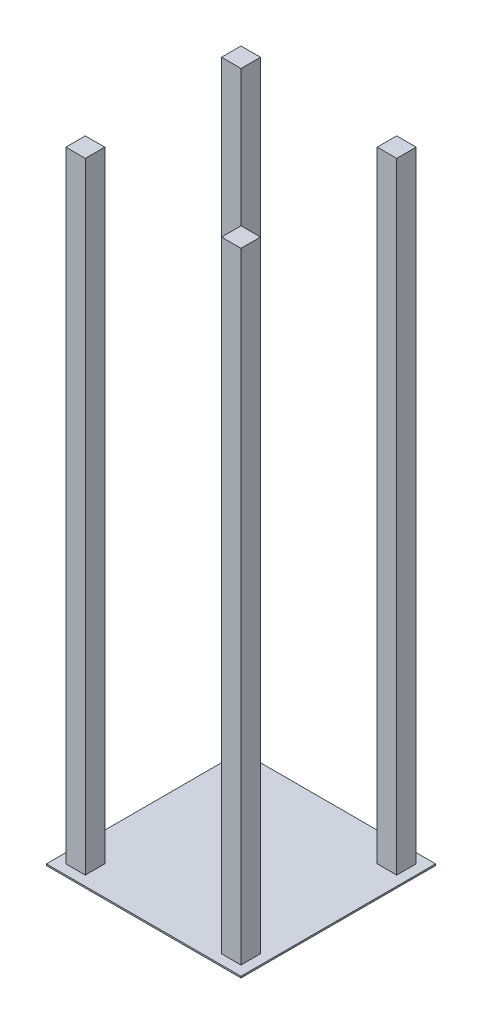
ISO-10303-21;
HEADER;
FILE_DESCRIPTION(('STEP AP214'),'2;1');
FILE_NAME('part.step','',(''),(''),'','','');
FILE_SCHEMA(('AUTOMOTIVE_DESIGN { 1 0 10303 214 1 1 1 1 }'));
ENDSEC;
DATA;
#1=APPLICATION_CONTEXT('core data for automotive mechanical design processes');
#2=APPLICATION_PROTOCOL_DEFINITION('international standard','automotive_design',2000,#1);
#3=PRODUCT_CONTEXT('',#1,'mechanical');
#4=PRODUCT('Part','Part','',(#3));
#5=PRODUCT_RELATED_PRODUCT_CATEGORY('part','',(#4));
#6=PRODUCT_DEFINITION_FORMATION('','',#4);
#7=PRODUCT_DEFINITION_CONTEXT('part definition',#1,'design');
#8=PRODUCT_DEFINITION('design','',#6,#7);
#9=PRODUCT_DEFINITION_SHAPE('','',#8);
#10=(LENGTH_UNIT() NAMED_UNIT(*) SI_UNIT(.MILLI.,.METRE.));
#11=(NAMED_UNIT(*) PLANE_ANGLE_UNIT() SI_UNIT($,.RADIAN.));
#12=(NAMED_UNIT(*) SI_UNIT($,.STERADIAN.) SOLID_ANGLE_UNIT());
#13=UNCERTAINTY_MEASURE_WITH_UNIT(LENGTH_MEASURE(1.E-05),#10,'distance_accuracy_value','');
#14=(GEOMETRIC_REPRESENTATION_CONTEXT(3) GLOBAL_UNCERTAINTY_ASSIGNED_CONTEXT((#13)) GLOBAL_UNIT_ASSIGNED_CONTEXT((#10,
#11,#12)) REPRESENTATION_CONTEXT('',''));
#15=CARTESIAN_POINT('',(0.,0.,0.));
#16=DIRECTION('',(0.,0.,1.));
#17=DIRECTION('',(1.,0.,0.));
#18=AXIS2_PLACEMENT_3D('',#15,#16,#17);
#19=CARTESIAN_POINT('',(0.,2.,0.));
#20=DIRECTION('',(0.,1.,0.));
#21=DIRECTION('',(0.,0.,1.));
#22=AXIS2_PLACEMENT_3D('',#19,#20,#21);
#23=PLANE('',#22);
#24=DIRECTION('',(0.,0.,-1.));
#25=VECTOR('',#24,1.);
#26=CARTESIAN_POINT('',(127.,2.,-127.));
#27=LINE('',#26,#25);
#28=CARTESIAN_POINT('',(127.,2.,127.));
#29=VERTEX_POINT('',#28);
#30=CARTESIAN_POINT('',(127.,2.,-127.));
#31=VERTEX_POINT('',#30);
#32=EDGE_CURVE('E333',#29,#31,#27,.T.);
#33=ORIENTED_EDGE('',*,*,#32,.T.);
#34=DIRECTION('',(-1.,0.,0.));
#35=VECTOR('',#34,1.);
#36=CARTESIAN_POINT('',(-127.,2.,-127.));
#37=LINE('',#36,#35);
#38=CARTESIAN_POINT('',(-127.,2.,-127.));
#39=VERTEX_POINT('',#38);
#40=EDGE_CURVE('E337',#31,#39,#37,.T.);
#41=ORIENTED_EDGE('',*,*,#40,.T.);
#42=DIRECTION('',(0.,0.,1.));
#43=VECTOR('',#42,1.);
#44=CARTESIAN_POINT('',(-127.,2.,-127.));
#45=LINE('',#44,#43);
#46=CARTESIAN_POINT('',(-127.,2.,127.));
#47=VERTEX_POINT('',#46);
#48=EDGE_CURVE('E341',#39,#47,#45,.T.);
#49=ORIENTED_EDGE('',*,*,#48,.T.);
#50=DIRECTION('',(1.,0.,0.));
#51=VECTOR('',#50,1.);
#52=CARTESIAN_POINT('',(-127.,2.,127.));
#53=LINE('',#52,#51);
#54=EDGE_CURVE('E344',#47,#29,#53,.T.);
#55=ORIENTED_EDGE('',*,*,#54,.T.);
#56=EDGE_LOOP('',(#33,#41,#49,#55));
#57=FACE_BOUND('',#56,.T.);
#58=DIRECTION('',(-1.,0.,0.));
#59=VECTOR('',#58,1.);
#60=CARTESIAN_POINT('',(-114.3,2.,-114.3));
#61=LINE('',#60,#59);
#62=CARTESIAN_POINT('',(-88.9000000000001,2.,-114.3));
#63=VERTEX_POINT('',#62);
#64=CARTESIAN_POINT('',(-114.3,2.,-114.3));
#65=VERTEX_POINT('',#64);
#66=EDGE_CURVE('E310',#63,#65,#61,.T.);
#67=ORIENTED_EDGE('',*,*,#66,.F.);
#68=DIRECTION('',(0.,0.,-1.));
#69=VECTOR('',#68,1.);
#70=CARTESIAN_POINT('',(-88.9000000000001,2.,-114.3));
#71=LINE('',#70,#69);
#72=CARTESIAN_POINT('',(-88.9000000000001,2.,-88.9));
#73=VERTEX_POINT('',#72);
#74=EDGE_CURVE('E291',#73,#63,#71,.T.);
#75=ORIENTED_EDGE('',*,*,#74,.F.);
#76=DIRECTION('',(1.,0.,0.));
#77=VECTOR('',#76,1.);
#78=CARTESIAN_POINT('',(-114.3,2.,-88.9));
#79=LINE('',#78,#77);
#80=CARTESIAN_POINT('',(-114.3,2.,-88.9));
#81=VERTEX_POINT('',#80);
#82=EDGE_CURVE('E297',#81,#73,#79,.T.);
#83=ORIENTED_EDGE('',*,*,#82,.F.);
#84=DIRECTION('',(0.,0.,1.));
#85=VECTOR('',#84,1.);
#86=CARTESIAN_POINT('',(-114.3,2.,-114.3));
#87=LINE('',#86,#85);
#88=EDGE_CURVE('E313',#65,#81,#87,.T.);
#89=ORIENTED_EDGE('',*,*,#88,.F.);
#90=EDGE_LOOP('',(#67,#75,#83,#89));
#91=FACE_BOUND('',#90,.T.);
#92=DIRECTION('',(-1.,0.,0.));
#93=VECTOR('',#92,1.);
#94=CARTESIAN_POINT('',(-114.3,2.,88.9));
#95=LINE('',#94,#93);
#96=CARTESIAN_POINT('',(-88.9000000000001,2.,88.9));
#97=VERTEX_POINT('',#96);
#98=CARTESIAN_POINT('',(-114.3,2.,88.9));
#99=VERTEX_POINT('',#98);
#100=EDGE_CURVE('E269',#97,#99,#95,.T.);
#101=ORIENTED_EDGE('',*,*,#100,.F.);
#102=DIRECTION('',(0.,0.,-1.));
#103=VECTOR('',#102,1.);
#104=CARTESIAN_POINT('',(-88.9000000000001,2.,88.9));
#105=LINE('',#104,#103);
#106=CARTESIAN_POINT('',(-88.9000000000001,2.,114.3));
#107=VERTEX_POINT('',#106);
#108=EDGE_CURVE('E250',#107,#97,#105,.T.);
#109=ORIENTED_EDGE('',*,*,#108,.F.);
#110=DIRECTION('',(1.,0.,0.));
#111=VECTOR('',#110,1.);
#112=CARTESIAN_POINT('',(-114.3,2.,114.3));
#113=LINE('',#112,#111);
#114=CARTESIAN_POINT('',(-114.3,2.,114.3));
#115=VERTEX_POINT('',#114);
#116=EDGE_CURVE('E256',#115,#107,#113,.T.);
#117=ORIENTED_EDGE('',*,*,#116,.F.);
#118=DIRECTION('',(0.,0.,1.));
#119=VECTOR('',#118,1.);
#120=CARTESIAN_POINT('',(-114.3,2.,88.9));
#121=LINE('',#120,#119);
#122=EDGE_CURVE('E272',#99,#115,#121,.T.);
#123=ORIENTED_EDGE('',*,*,#122,.F.);
#124=EDGE_LOOP('',(#101,#109,#117,#123));
#125=FACE_BOUND('',#124,.T.);
#126=DIRECTION('',(-1.,0.,0.));
#127=VECTOR('',#126,1.);
#128=CARTESIAN_POINT('',(88.9,2.,88.9));
#129=LINE('',#128,#127);
#130=CARTESIAN_POINT('',(114.3,2.,88.9));
#131=VERTEX_POINT('',#130);
#132=CARTESIAN_POINT('',(88.9,2.,88.9));
#133=VERTEX_POINT('',#132);
#134=EDGE_CURVE('E211',#131,#133,#129,.T.);
#135=ORIENTED_EDGE('',*,*,#134,.F.);
#136=DIRECTION('',(0.,0.,-1.));
#137=VECTOR('',#136,1.);
#138=CARTESIAN_POINT('',(114.3,2.,88.9));
#139=LINE('',#138,#137);
#140=CARTESIAN_POINT('',(114.3,2.,114.3));
#141=VERTEX_POINT('',#140);
#142=EDGE_CURVE('E206',#141,#131,#139,.T.);
#143=ORIENTED_EDGE('',*,*,#142,.F.);
#144=DIRECTION('',(1.,0.,0.));
#145=VECTOR('',#144,1.);
#146=CARTESIAN_POINT('',(88.9,2.,114.3));
#147=LINE('',#146,#145);
#148=CARTESIAN_POINT('',(88.9,2.,114.3));
#149=VERTEX_POINT('',#148);
#150=EDGE_CURVE('E221',#149,#141,#147,.T.);
#151=ORIENTED_EDGE('',*,*,#150,.F.);
#152=DIRECTION('',(0.,0.,1.));
#153=VECTOR('',#152,1.);
#154=CARTESIAN_POINT('',(88.9,2.,88.9));
#155=LINE('',#154,#153);
#156=EDGE_CURVE('E233',#133,#149,#155,.T.);
#157=ORIENTED_EDGE('',*,*,#156,.F.);
#158=EDGE_LOOP('',(#135,#143,#151,#157));
#159=FACE_BOUND('',#158,.T.);
#160=DIRECTION('',(-1.,0.,0.));
#161=VECTOR('',#160,1.);
#162=CARTESIAN_POINT('',(88.9,2.,-114.3));
#163=LINE('',#162,#161);
#164=CARTESIAN_POINT('',(114.3,2.,-114.3));
#165=VERTEX_POINT('',#164);
#166=CARTESIAN_POINT('',(88.9,2.,-114.3));
#167=VERTEX_POINT('',#166);
#168=EDGE_CURVE('E635',#165,#167,#163,.T.);
#169=ORIENTED_EDGE('',*,*,#168,.F.);
#170=DIRECTION('',(0.,0.,-1.));
#171=VECTOR('',#170,1.);
#172=CARTESIAN_POINT('',(114.3,2.,-114.3));
#173=LINE('',#172,#171);
#174=CARTESIAN_POINT('',(114.3,2.,-88.9));
#175=VERTEX_POINT('',#174);
#176=EDGE_CURVE('E203',#175,#165,#173,.T.);
#177=ORIENTED_EDGE('',*,*,#176,.F.);
#178=DIRECTION('',(1.,0.,0.));
#179=VECTOR('',#178,1.);
#180=CARTESIAN_POINT('',(88.9,2.,-88.9));
#181=LINE('',#180,#179);
#182=CARTESIAN_POINT('',(88.9,2.,-88.9));
#183=VERTEX_POINT('',#182);
#184=EDGE_CURVE('E199',#183,#175,#181,.T.);
#185=ORIENTED_EDGE('',*,*,#184,.F.);
#186=DIRECTION('',(0.,0.,1.));
#187=VECTOR('',#186,1.);
#188=CARTESIAN_POINT('',(88.9,2.,-114.3));
#189=LINE('',#188,#187);
#190=EDGE_CURVE('E631',#167,#183,#189,.T.);
#191=ORIENTED_EDGE('',*,*,#190,.F.);
#192=EDGE_LOOP('',(#169,#177,#185,#191));
#193=FACE_BOUND('',#192,.T.);
#194=ADVANCED_FACE('F39',(#57,#91,#125,#159,#193),#23,.T.);
#195=CARTESIAN_POINT('',(127.,2.,-127.));
#196=DIRECTION('',(-1.,0.,0.));
#197=DIRECTION('',(0.,0.,1.));
#198=AXIS2_PLACEMENT_3D('',#195,#196,#197);
#199=PLANE('',#198);
#200=DIRECTION('',(0.,0.,-1.));
#201=VECTOR('',#200,1.);
#202=CARTESIAN_POINT('',(127.,0.,-127.));
#203=LINE('',#202,#201);
#204=CARTESIAN_POINT('',(127.,0.,127.));
#205=VERTEX_POINT('',#204);
#206=CARTESIAN_POINT('',(127.,0.,-127.));
#207=VERTEX_POINT('',#206);
#208=EDGE_CURVE('E332',#205,#207,#203,.T.);
#209=ORIENTED_EDGE('',*,*,#208,.T.);
#210=DIRECTION('',(0.,-1.,0.));
#211=VECTOR('',#210,1.);
#212=CARTESIAN_POINT('',(127.,2.,-127.));
#213=LINE('',#212,#211);
#214=EDGE_CURVE('E11',#31,#207,#213,.T.);
#215=ORIENTED_EDGE('',*,*,#214,.F.);
#216=ORIENTED_EDGE('',*,*,#32,.F.);
#217=DIRECTION('',(0.,-1.,0.));
#218=VECTOR('',#217,1.);
#219=CARTESIAN_POINT('',(127.,2.,127.));
#220=LINE('',#219,#218);
#221=EDGE_CURVE('E347',#29,#205,#220,.T.);
#222=ORIENTED_EDGE('',*,*,#221,.T.);
#223=EDGE_LOOP('',(#209,#215,#216,#222));
#224=FACE_BOUND('',#223,.T.);
#225=ADVANCED_FACE('F41',(#224),#199,.F.);
#226=CARTESIAN_POINT('',(-127.,2.,-127.));
#227=DIRECTION('',(0.,0.,1.));
#228=DIRECTION('',(1.,0.,0.));
#229=AXIS2_PLACEMENT_3D('',#226,#227,#228);
#230=PLANE('',#229);
#231=DIRECTION('',(-1.,0.,0.));
#232=VECTOR('',#231,1.);
#233=CARTESIAN_POINT('',(-127.,0.,-127.));
#234=LINE('',#233,#232);
#235=CARTESIAN_POINT('',(-127.,0.,-127.));
#236=VERTEX_POINT('',#235);
#237=EDGE_CURVE('E351',#207,#236,#234,.T.);
#238=ORIENTED_EDGE('',*,*,#237,.T.);
#239=DIRECTION('',(0.,-1.,0.));
#240=VECTOR('',#239,1.);
#241=CARTESIAN_POINT('',(-127.,2.,-127.));
#242=LINE('',#241,#240);
#243=EDGE_CURVE('E48',#39,#236,#242,.T.);
#244=ORIENTED_EDGE('',*,*,#243,.F.);
#245=ORIENTED_EDGE('',*,*,#40,.F.);
#246=ORIENTED_EDGE('',*,*,#214,.T.);
#247=EDGE_LOOP('',(#238,#244,#245,#246));
#248=FACE_BOUND('',#247,.T.);
#249=ADVANCED_FACE('F387',(#248),#230,.F.);
#250=CARTESIAN_POINT('',(-127.,2.,-127.));
#251=DIRECTION('',(1.,0.,0.));
#252=DIRECTION('',(0.,0.,-1.));
#253=AXIS2_PLACEMENT_3D('',#250,#251,#252);
#254=PLANE('',#253);
#255=DIRECTION('',(0.,0.,1.));
#256=VECTOR('',#255,1.);
#257=CARTESIAN_POINT('',(-127.,0.,-127.));
#258=LINE('',#257,#256);
#259=CARTESIAN_POINT('',(-127.,0.,127.));
#260=VERTEX_POINT('',#259);
#261=EDGE_CURVE('E354',#236,#260,#258,.T.);
#262=ORIENTED_EDGE('',*,*,#261,.T.);
#263=DIRECTION('',(0.,-1.,0.));
#264=VECTOR('',#263,1.);
#265=CARTESIAN_POINT('',(-127.,2.,127.));
#266=LINE('',#265,#264);
#267=EDGE_CURVE('E362',#47,#260,#266,.T.);
#268=ORIENTED_EDGE('',*,*,#267,.F.);
#269=ORIENTED_EDGE('',*,*,#48,.F.);
#270=ORIENTED_EDGE('',*,*,#243,.T.);
#271=EDGE_LOOP('',(#262,#268,#269,#270));
#272=FACE_BOUND('',#271,.T.);
#273=ADVANCED_FACE('F371',(#272),#254,.F.);
#274=CARTESIAN_POINT('',(-127.,2.,127.));
#275=DIRECTION('',(0.,0.,-1.));
#276=DIRECTION('',(-1.,0.,0.));
#277=AXIS2_PLACEMENT_3D('',#274,#275,#276);
#278=PLANE('',#277);
#279=DIRECTION('',(1.,0.,0.));
#280=VECTOR('',#279,1.);
#281=CARTESIAN_POINT('',(-127.,0.,127.));
#282=LINE('',#281,#280);
#283=EDGE_CURVE('E338',#260,#205,#282,.T.);
#284=ORIENTED_EDGE('',*,*,#283,.T.);
#285=ORIENTED_EDGE('',*,*,#221,.F.);
#286=ORIENTED_EDGE('',*,*,#54,.F.);
#287=ORIENTED_EDGE('',*,*,#267,.T.);
#288=EDGE_LOOP('',(#284,#285,#286,#287));
#289=FACE_BOUND('',#288,.T.);
#290=ADVANCED_FACE('F380',(#289),#278,.F.);
#291=CARTESIAN_POINT('',(0.,0.,0.));
#292=DIRECTION('',(0.,1.,0.));
#293=DIRECTION('',(0.,0.,1.));
#294=AXIS2_PLACEMENT_3D('',#291,#292,#293);
#295=PLANE('',#294);
#296=ORIENTED_EDGE('',*,*,#208,.F.);
#297=ORIENTED_EDGE('',*,*,#283,.F.);
#298=ORIENTED_EDGE('',*,*,#261,.F.);
#299=ORIENTED_EDGE('',*,*,#237,.F.);
#300=EDGE_LOOP('',(#296,#297,#298,#299));
#301=FACE_BOUND('',#300,.T.);
#302=ADVANCED_FACE('F377',(#301),#295,.F.);
#303=CARTESIAN_POINT('',(-88.9000000000001,812.,-114.3));
#304=DIRECTION('',(-1.,0.,0.));
#305=DIRECTION('',(0.,0.,1.));
#306=AXIS2_PLACEMENT_3D('',#303,#304,#305);
#307=PLANE('',#306);
#308=ORIENTED_EDGE('',*,*,#74,.T.);
#309=DIRECTION('',(0.,-1.,0.));
#310=VECTOR('',#309,1.);
#311=CARTESIAN_POINT('',(-88.9000000000001,812.,-114.3));
#312=LINE('',#311,#310);
#313=CARTESIAN_POINT('',(-88.9000000000001,812.,-114.3));
#314=VERTEX_POINT('',#313);
#315=EDGE_CURVE('E329',#314,#63,#312,.T.);
#316=ORIENTED_EDGE('',*,*,#315,.F.);
#317=DIRECTION('',(0.,0.,-1.));
#318=VECTOR('',#317,1.);
#319=CARTESIAN_POINT('',(-88.9000000000001,812.,-114.3));
#320=LINE('',#319,#318);
#321=CARTESIAN_POINT('',(-88.9000000000001,812.,-88.9));
#322=VERTEX_POINT('',#321);
#323=EDGE_CURVE('E292',#322,#314,#320,.T.);
#324=ORIENTED_EDGE('',*,*,#323,.F.);
#325=DIRECTION('',(0.,-1.,0.));
#326=VECTOR('',#325,1.);
#327=CARTESIAN_POINT('',(-88.9000000000001,812.,-88.9));
#328=LINE('',#327,#326);
#329=EDGE_CURVE('E306',#322,#73,#328,.T.);
#330=ORIENTED_EDGE('',*,*,#329,.T.);
#331=EDGE_LOOP('',(#308,#316,#324,#330));
#332=FACE_BOUND('',#331,.T.);
#333=ADVANCED_FACE('F400',(#332),#307,.F.);
#334=CARTESIAN_POINT('',(-114.3,812.,-114.3));
#335=DIRECTION('',(0.,0.,1.));
#336=DIRECTION('',(1.,0.,0.));
#337=AXIS2_PLACEMENT_3D('',#334,#335,#336);
#338=PLANE('',#337);
#339=ORIENTED_EDGE('',*,*,#66,.T.);
#340=DIRECTION('',(0.,-1.,0.));
#341=VECTOR('',#340,1.);
#342=CARTESIAN_POINT('',(-114.3,812.,-114.3));
#343=LINE('',#342,#341);
#344=CARTESIAN_POINT('',(-114.3,812.,-114.3));
#345=VERTEX_POINT('',#344);
#346=EDGE_CURVE('E325',#345,#65,#343,.T.);
#347=ORIENTED_EDGE('',*,*,#346,.F.);
#348=DIRECTION('',(-1.,0.,0.));
#349=VECTOR('',#348,1.);
#350=CARTESIAN_POINT('',(-114.3,812.,-114.3));
#351=LINE('',#350,#349);
#352=EDGE_CURVE('E296',#314,#345,#351,.T.);
#353=ORIENTED_EDGE('',*,*,#352,.F.);
#354=ORIENTED_EDGE('',*,*,#315,.T.);
#355=EDGE_LOOP('',(#339,#347,#353,#354));
#356=FACE_BOUND('',#355,.T.);
#357=ADVANCED_FACE('F419',(#356),#338,.F.);
#358=CARTESIAN_POINT('',(-114.3,812.,-114.3));
#359=DIRECTION('',(1.,0.,0.));
#360=DIRECTION('',(0.,0.,-1.));
#361=AXIS2_PLACEMENT_3D('',#358,#359,#360);
#362=PLANE('',#361);
#363=ORIENTED_EDGE('',*,*,#88,.T.);
#364=DIRECTION('',(0.,-1.,0.));
#365=VECTOR('',#364,1.);
#366=CARTESIAN_POINT('',(-114.3,812.,-88.9));
#367=LINE('',#366,#365);
#368=CARTESIAN_POINT('',(-114.3,812.,-88.9));
#369=VERTEX_POINT('',#368);
#370=EDGE_CURVE('E322',#369,#81,#367,.T.);
#371=ORIENTED_EDGE('',*,*,#370,.F.);
#372=DIRECTION('',(0.,0.,1.));
#373=VECTOR('',#372,1.);
#374=CARTESIAN_POINT('',(-114.3,812.,-114.3));
#375=LINE('',#374,#373);
#376=EDGE_CURVE('E300',#345,#369,#375,.T.);
#377=ORIENTED_EDGE('',*,*,#376,.F.);
#378=ORIENTED_EDGE('',*,*,#346,.T.);
#379=EDGE_LOOP('',(#363,#371,#377,#378));
#380=FACE_BOUND('',#379,.T.);
#381=ADVANCED_FACE('F426',(#380),#362,.F.);
#382=CARTESIAN_POINT('',(-114.3,812.,-88.9));
#383=DIRECTION('',(0.,0.,-1.));
#384=DIRECTION('',(-1.,0.,0.));
#385=AXIS2_PLACEMENT_3D('',#382,#383,#384);
#386=PLANE('',#385);
#387=ORIENTED_EDGE('',*,*,#82,.T.);
#388=ORIENTED_EDGE('',*,*,#329,.F.);
#389=DIRECTION('',(1.,0.,0.));
#390=VECTOR('',#389,1.);
#391=CARTESIAN_POINT('',(-114.3,812.,-88.9));
#392=LINE('',#391,#390);
#393=EDGE_CURVE('E303',#369,#322,#392,.T.);
#394=ORIENTED_EDGE('',*,*,#393,.F.);
#395=ORIENTED_EDGE('',*,*,#370,.T.);
#396=EDGE_LOOP('',(#387,#388,#394,#395));
#397=FACE_BOUND('',#396,.T.);
#398=ADVANCED_FACE('F433',(#397),#386,.F.);
#399=CARTESIAN_POINT('',(0.,812.,0.));
#400=DIRECTION('',(0.,1.,0.));
#401=DIRECTION('',(0.,0.,1.));
#402=AXIS2_PLACEMENT_3D('',#399,#400,#401);
#403=PLANE('',#402);
#404=ORIENTED_EDGE('',*,*,#323,.T.);
#405=ORIENTED_EDGE('',*,*,#352,.T.);
#406=ORIENTED_EDGE('',*,*,#376,.T.);
#407=ORIENTED_EDGE('',*,*,#393,.T.);
#408=EDGE_LOOP('',(#404,#405,#406,#407));
#409=FACE_BOUND('',#408,.T.);
#410=ADVANCED_FACE('F441',(#409),#403,.T.);
#411=CARTESIAN_POINT('',(-88.9000000000001,812.,88.9));
#412=DIRECTION('',(-1.,0.,0.));
#413=DIRECTION('',(0.,0.,1.));
#414=AXIS2_PLACEMENT_3D('',#411,#412,#413);
#415=PLANE('',#414);
#416=ORIENTED_EDGE('',*,*,#108,.T.);
#417=DIRECTION('',(0.,-1.,0.));
#418=VECTOR('',#417,1.);
#419=CARTESIAN_POINT('',(-88.9000000000001,812.,88.9));
#420=LINE('',#419,#418);
#421=CARTESIAN_POINT('',(-88.9000000000001,812.,88.9));
#422=VERTEX_POINT('',#421);
#423=EDGE_CURVE('E288',#422,#97,#420,.T.);
#424=ORIENTED_EDGE('',*,*,#423,.F.);
#425=DIRECTION('',(0.,0.,-1.));
#426=VECTOR('',#425,1.);
#427=CARTESIAN_POINT('',(-88.9000000000001,812.,88.9));
#428=LINE('',#427,#426);
#429=CARTESIAN_POINT('',(-88.9000000000001,812.,114.3));
#430=VERTEX_POINT('',#429);
#431=EDGE_CURVE('E251',#430,#422,#428,.T.);
#432=ORIENTED_EDGE('',*,*,#431,.F.);
#433=DIRECTION('',(0.,-1.,0.));
#434=VECTOR('',#433,1.);
#435=CARTESIAN_POINT('',(-88.9000000000001,812.,114.3));
#436=LINE('',#435,#434);
#437=EDGE_CURVE('E265',#430,#107,#436,.T.);
#438=ORIENTED_EDGE('',*,*,#437,.T.);
#439=EDGE_LOOP('',(#416,#424,#432,#438));
#440=FACE_BOUND('',#439,.T.);
#441=ADVANCED_FACE('F449',(#440),#415,.F.);
#442=CARTESIAN_POINT('',(-114.3,812.,88.9));
#443=DIRECTION('',(0.,0.,1.));
#444=DIRECTION('',(1.,0.,0.));
#445=AXIS2_PLACEMENT_3D('',#442,#443,#444);
#446=PLANE('',#445);
#447=ORIENTED_EDGE('',*,*,#100,.T.);
#448=DIRECTION('',(0.,-1.,0.));
#449=VECTOR('',#448,1.);
#450=CARTESIAN_POINT('',(-114.3,812.,88.9));
#451=LINE('',#450,#449);
#452=CARTESIAN_POINT('',(-114.3,812.,88.9));
#453=VERTEX_POINT('',#452);
#454=EDGE_CURVE('E284',#453,#99,#451,.T.);
#455=ORIENTED_EDGE('',*,*,#454,.F.);
#456=DIRECTION('',(-1.,0.,0.));
#457=VECTOR('',#456,1.);
#458=CARTESIAN_POINT('',(-114.3,812.,88.9));
#459=LINE('',#458,#457);
#460=EDGE_CURVE('E255',#422,#453,#459,.T.);
#461=ORIENTED_EDGE('',*,*,#460,.F.);
#462=ORIENTED_EDGE('',*,*,#423,.T.);
#463=EDGE_LOOP('',(#447,#455,#461,#462));
#464=FACE_BOUND('',#463,.T.);
#465=ADVANCED_FACE('F457',(#464),#446,.F.);
#466=CARTESIAN_POINT('',(-114.3,812.,88.9));
#467=DIRECTION('',(1.,0.,0.));
#468=DIRECTION('',(0.,0.,-1.));
#469=AXIS2_PLACEMENT_3D('',#466,#467,#468);
#470=PLANE('',#469);
#471=ORIENTED_EDGE('',*,*,#122,.T.);
#472=DIRECTION('',(0.,-1.,0.));
#473=VECTOR('',#472,1.);
#474=CARTESIAN_POINT('',(-114.3,812.,114.3));
#475=LINE('',#474,#473);
#476=CARTESIAN_POINT('',(-114.3,812.,114.3));
#477=VERTEX_POINT('',#476);
#478=EDGE_CURVE('E281',#477,#115,#475,.T.);
#479=ORIENTED_EDGE('',*,*,#478,.F.);
#480=DIRECTION('',(0.,0.,1.));
#481=VECTOR('',#480,1.);
#482=CARTESIAN_POINT('',(-114.3,812.,88.9));
#483=LINE('',#482,#481);
#484=EDGE_CURVE('E259',#453,#477,#483,.T.);
#485=ORIENTED_EDGE('',*,*,#484,.F.);
#486=ORIENTED_EDGE('',*,*,#454,.T.);
#487=EDGE_LOOP('',(#471,#479,#485,#486));
#488=FACE_BOUND('',#487,.T.);
#489=ADVANCED_FACE('F465',(#488),#470,.F.);
#490=CARTESIAN_POINT('',(-114.3,812.,114.3));
#491=DIRECTION('',(0.,0.,-1.));
#492=DIRECTION('',(-1.,0.,0.));
#493=AXIS2_PLACEMENT_3D('',#490,#491,#492);
#494=PLANE('',#493);
#495=ORIENTED_EDGE('',*,*,#116,.T.);
#496=ORIENTED_EDGE('',*,*,#437,.F.);
#497=DIRECTION('',(1.,0.,0.));
#498=VECTOR('',#497,1.);
#499=CARTESIAN_POINT('',(-114.3,812.,114.3));
#500=LINE('',#499,#498);
#501=EDGE_CURVE('E262',#477,#430,#500,.T.);
#502=ORIENTED_EDGE('',*,*,#501,.F.);
#503=ORIENTED_EDGE('',*,*,#478,.T.);
#504=EDGE_LOOP('',(#495,#496,#502,#503));
#505=FACE_BOUND('',#504,.T.);
#506=ADVANCED_FACE('F473',(#505),#494,.F.);
#507=CARTESIAN_POINT('',(0.,812.,0.));
#508=DIRECTION('',(0.,1.,0.));
#509=DIRECTION('',(0.,0.,1.));
#510=AXIS2_PLACEMENT_3D('',#507,#508,#509);
#511=PLANE('',#510);
#512=ORIENTED_EDGE('',*,*,#431,.T.);
#513=ORIENTED_EDGE('',*,*,#460,.T.);
#514=ORIENTED_EDGE('',*,*,#484,.T.);
#515=ORIENTED_EDGE('',*,*,#501,.T.);
#516=EDGE_LOOP('',(#512,#513,#514,#515));
#517=FACE_BOUND('',#516,.T.);
#518=ADVANCED_FACE('F481',(#517),#511,.T.);
#519=CARTESIAN_POINT('',(114.3,812.,88.9));
#520=DIRECTION('',(-1.,0.,0.));
#521=DIRECTION('',(0.,0.,1.));
#522=AXIS2_PLACEMENT_3D('',#519,#520,#521);
#523=PLANE('',#522);
#524=ORIENTED_EDGE('',*,*,#142,.T.);
#525=DIRECTION('',(0.,-1.,0.));
#526=VECTOR('',#525,1.);
#527=CARTESIAN_POINT('',(114.3,812.,88.9));
#528=LINE('',#527,#526);
#529=CARTESIAN_POINT('',(114.3,812.,88.9));
#530=VERTEX_POINT('',#529);
#531=EDGE_CURVE('E247',#530,#131,#528,.T.);
#532=ORIENTED_EDGE('',*,*,#531,.F.);
#533=DIRECTION('',(0.,0.,-1.));
#534=VECTOR('',#533,1.);
#535=CARTESIAN_POINT('',(114.3,812.,88.9));
#536=LINE('',#535,#534);
#537=CARTESIAN_POINT('',(114.3,812.,114.3));
#538=VERTEX_POINT('',#537);
#539=EDGE_CURVE('E216',#538,#530,#536,.T.);
#540=ORIENTED_EDGE('',*,*,#539,.F.);
#541=DIRECTION('',(0.,-1.,0.));
#542=VECTOR('',#541,1.);
#543=CARTESIAN_POINT('',(114.3,812.,114.3));
#544=LINE('',#543,#542);
#545=EDGE_CURVE('E229',#538,#141,#544,.T.);
#546=ORIENTED_EDGE('',*,*,#545,.T.);
#547=EDGE_LOOP('',(#524,#532,#540,#546));
#548=FACE_BOUND('',#547,.T.);
#549=ADVANCED_FACE('F489',(#548),#523,.F.);
#550=CARTESIAN_POINT('',(88.9,812.,88.9));
#551=DIRECTION('',(0.,0.,1.));
#552=DIRECTION('',(1.,0.,0.));
#553=AXIS2_PLACEMENT_3D('',#550,#551,#552);
#554=PLANE('',#553);
#555=ORIENTED_EDGE('',*,*,#134,.T.);
#556=DIRECTION('',(0.,-1.,0.));
#557=VECTOR('',#556,1.);
#558=CARTESIAN_POINT('',(88.9,812.,88.9));
#559=LINE('',#558,#557);
#560=CARTESIAN_POINT('',(88.9,812.,88.9));
#561=VERTEX_POINT('',#560);
#562=EDGE_CURVE('E243',#561,#133,#559,.T.);
#563=ORIENTED_EDGE('',*,*,#562,.F.);
#564=DIRECTION('',(-1.,0.,0.));
#565=VECTOR('',#564,1.);
#566=CARTESIAN_POINT('',(88.9,812.,88.9));
#567=LINE('',#566,#565);
#568=EDGE_CURVE('E220',#530,#561,#567,.T.);
#569=ORIENTED_EDGE('',*,*,#568,.F.);
#570=ORIENTED_EDGE('',*,*,#531,.T.);
#571=EDGE_LOOP('',(#555,#563,#569,#570));
#572=FACE_BOUND('',#571,.T.);
#573=ADVANCED_FACE('F497',(#572),#554,.F.);
#574=CARTESIAN_POINT('',(88.9,812.,88.9));
#575=DIRECTION('',(1.,0.,0.));
#576=DIRECTION('',(0.,0.,-1.));
#577=AXIS2_PLACEMENT_3D('',#574,#575,#576);
#578=PLANE('',#577);
#579=ORIENTED_EDGE('',*,*,#156,.T.);
#580=DIRECTION('',(0.,-1.,0.));
#581=VECTOR('',#580,1.);
#582=CARTESIAN_POINT('',(88.9,812.,114.3));
#583=LINE('',#582,#581);
#584=CARTESIAN_POINT('',(88.9,812.,114.3));
#585=VERTEX_POINT('',#584);
#586=EDGE_CURVE('E63',#585,#149,#583,.T.);
#587=ORIENTED_EDGE('',*,*,#586,.F.);
#588=DIRECTION('',(0.,0.,1.));
#589=VECTOR('',#588,1.);
#590=CARTESIAN_POINT('',(88.9,812.,88.9));
#591=LINE('',#590,#589);
#592=EDGE_CURVE('E224',#561,#585,#591,.T.);
#593=ORIENTED_EDGE('',*,*,#592,.F.);
#594=ORIENTED_EDGE('',*,*,#562,.T.);
#595=EDGE_LOOP('',(#579,#587,#593,#594));
#596=FACE_BOUND('',#595,.T.);
#597=ADVANCED_FACE('F505',(#596),#578,.F.);
#598=CARTESIAN_POINT('',(88.9,812.,114.3));
#599=DIRECTION('',(0.,0.,-1.));
#600=DIRECTION('',(-1.,0.,0.));
#601=AXIS2_PLACEMENT_3D('',#598,#599,#600);
#602=PLANE('',#601);
#603=ORIENTED_EDGE('',*,*,#150,.T.);
#604=ORIENTED_EDGE('',*,*,#545,.F.);
#605=DIRECTION('',(1.,0.,0.));
#606=VECTOR('',#605,1.);
#607=CARTESIAN_POINT('',(88.9,812.,114.3));
#608=LINE('',#607,#606);
#609=EDGE_CURVE('E227',#585,#538,#608,.T.);
#610=ORIENTED_EDGE('',*,*,#609,.F.);
#611=ORIENTED_EDGE('',*,*,#586,.T.);
#612=EDGE_LOOP('',(#603,#604,#610,#611));
#613=FACE_BOUND('',#612,.T.);
#614=ADVANCED_FACE('F513',(#613),#602,.F.);
#615=CARTESIAN_POINT('',(0.,812.,0.));
#616=DIRECTION('',(0.,1.,0.));
#617=DIRECTION('',(0.,0.,1.));
#618=AXIS2_PLACEMENT_3D('',#615,#616,#617);
#619=PLANE('',#618);
#620=ORIENTED_EDGE('',*,*,#539,.T.);
#621=ORIENTED_EDGE('',*,*,#568,.T.);
#622=ORIENTED_EDGE('',*,*,#592,.T.);
#623=ORIENTED_EDGE('',*,*,#609,.T.);
#624=EDGE_LOOP('',(#620,#621,#622,#623));
#625=FACE_BOUND('',#624,.T.);
#626=ADVANCED_FACE('F521',(#625),#619,.T.);
#627=CARTESIAN_POINT('',(114.3,812.,-114.3));
#628=DIRECTION('',(-1.,0.,0.));
#629=DIRECTION('',(0.,0.,1.));
#630=AXIS2_PLACEMENT_3D('',#627,#628,#629);
#631=PLANE('',#630);
#632=ORIENTED_EDGE('',*,*,#176,.T.);
#633=DIRECTION('',(0.,-1.,0.));
#634=VECTOR('',#633,1.);
#635=CARTESIAN_POINT('',(114.3,812.,-114.3));
#636=LINE('',#635,#634);
#637=CARTESIAN_POINT('',(114.3,812.,-114.3));
#638=VERTEX_POINT('',#637);
#639=EDGE_CURVE('E182',#638,#165,#636,.T.);
#640=ORIENTED_EDGE('',*,*,#639,.F.);
#641=DIRECTION('',(0.,0.,-1.));
#642=VECTOR('',#641,1.);
#643=CARTESIAN_POINT('',(114.3,812.,-114.3));
#644=LINE('',#643,#642);
#645=CARTESIAN_POINT('',(114.3,812.,-88.9));
#646=VERTEX_POINT('',#645);
#647=EDGE_CURVE('E190',#646,#638,#644,.T.);
#648=ORIENTED_EDGE('',*,*,#647,.F.);
#649=DIRECTION('',(0.,-1.,0.));
#650=VECTOR('',#649,1.);
#651=CARTESIAN_POINT('',(114.3,812.,-88.9));
#652=LINE('',#651,#650);
#653=EDGE_CURVE('E627',#646,#175,#652,.T.);
#654=ORIENTED_EDGE('',*,*,#653,.T.);
#655=EDGE_LOOP('',(#632,#640,#648,#654));
#656=FACE_BOUND('',#655,.T.);
#657=ADVANCED_FACE('F201',(#656),#631,.F.);
#658=CARTESIAN_POINT('',(88.9,812.,-114.3));
#659=DIRECTION('',(0.,0.,1.));
#660=DIRECTION('',(1.,0.,0.));
#661=AXIS2_PLACEMENT_3D('',#658,#659,#660);
#662=PLANE('',#661);
#663=ORIENTED_EDGE('',*,*,#168,.T.);
#664=DIRECTION('',(0.,-1.,0.));
#665=VECTOR('',#664,1.);
#666=CARTESIAN_POINT('',(88.9,812.,-114.3));
#667=LINE('',#666,#665);
#668=CARTESIAN_POINT('',(88.9,812.,-114.3));
#669=VERTEX_POINT('',#668);
#670=EDGE_CURVE('E185',#669,#167,#667,.T.);
#671=ORIENTED_EDGE('',*,*,#670,.F.);
#672=DIRECTION('',(-1.,0.,0.));
#673=VECTOR('',#672,1.);
#674=CARTESIAN_POINT('',(88.9,812.,-114.3));
#675=LINE('',#674,#673);
#676=EDGE_CURVE('E178',#638,#669,#675,.T.);
#677=ORIENTED_EDGE('',*,*,#676,.F.);
#678=ORIENTED_EDGE('',*,*,#639,.T.);
#679=EDGE_LOOP('',(#663,#671,#677,#678));
#680=FACE_BOUND('',#679,.T.);
#681=ADVANCED_FACE('F180',(#680),#662,.F.);
#682=CARTESIAN_POINT('',(88.9,812.,-114.3));
#683=DIRECTION('',(1.,0.,0.));
#684=DIRECTION('',(0.,0.,-1.));
#685=AXIS2_PLACEMENT_3D('',#682,#683,#684);
#686=PLANE('',#685);
#687=ORIENTED_EDGE('',*,*,#190,.T.);
#688=DIRECTION('',(0.,-1.,0.));
#689=VECTOR('',#688,1.);
#690=CARTESIAN_POINT('',(88.9,812.,-88.9));
#691=LINE('',#690,#689);
#692=CARTESIAN_POINT('',(88.9,812.,-88.9));
#693=VERTEX_POINT('',#692);
#694=EDGE_CURVE('E55',#693,#183,#691,.T.);
#695=ORIENTED_EDGE('',*,*,#694,.F.);
#696=DIRECTION('',(0.,0.,1.));
#697=VECTOR('',#696,1.);
#698=CARTESIAN_POINT('',(88.9,812.,-114.3));
#699=LINE('',#698,#697);
#700=EDGE_CURVE('E189',#669,#693,#699,.T.);
#701=ORIENTED_EDGE('',*,*,#700,.F.);
#702=ORIENTED_EDGE('',*,*,#670,.T.);
#703=EDGE_LOOP('',(#687,#695,#701,#702));
#704=FACE_BOUND('',#703,.T.);
#705=ADVANCED_FACE('F541',(#704),#686,.F.);
#706=CARTESIAN_POINT('',(88.9,812.,-88.9));
#707=DIRECTION('',(0.,0.,-1.));
#708=DIRECTION('',(-1.,0.,0.));
#709=AXIS2_PLACEMENT_3D('',#706,#707,#708);
#710=PLANE('',#709);
#711=ORIENTED_EDGE('',*,*,#184,.T.);
#712=ORIENTED_EDGE('',*,*,#653,.F.);
#713=DIRECTION('',(1.,0.,0.));
#714=VECTOR('',#713,1.);
#715=CARTESIAN_POINT('',(88.9,812.,-88.9));
#716=LINE('',#715,#714);
#717=EDGE_CURVE('E194',#693,#646,#716,.T.);
#718=ORIENTED_EDGE('',*,*,#717,.F.);
#719=ORIENTED_EDGE('',*,*,#694,.T.);
#720=EDGE_LOOP('',(#711,#712,#718,#719));
#721=FACE_BOUND('',#720,.T.);
#722=ADVANCED_FACE('F548',(#721),#710,.F.);
#723=CARTESIAN_POINT('',(0.,812.,0.));
#724=DIRECTION('',(0.,1.,0.));
#725=DIRECTION('',(0.,0.,1.));
#726=AXIS2_PLACEMENT_3D('',#723,#724,#725);
#727=PLANE('',#726);
#728=ORIENTED_EDGE('',*,*,#647,.T.);
#729=ORIENTED_EDGE('',*,*,#676,.T.);
#730=ORIENTED_EDGE('',*,*,#700,.T.);
#731=ORIENTED_EDGE('',*,*,#717,.T.);
#732=EDGE_LOOP('',(#728,#729,#730,#731));
#733=FACE_BOUND('',#732,.T.);
#734=ADVANCED_FACE('F193',(#733),#727,.T.);
#735=CLOSED_SHELL('',(#194,#225,#249,#273,#290,#302,#333,#357,#381,#398,#410,#441,#465,#489,
#506,#518,#549,#573,#597,#614,#626,#657,#681,#705,#722,#734));
#736=MANIFOLD_SOLID_BREP('B2',#735);
#737=ADVANCED_BREP_SHAPE_REPRESENTATION('',(#18,#736),#14);
#738=SHAPE_DEFINITION_REPRESENTATION(#9,#737);
ENDSEC;
END-ISO-10303-21;
